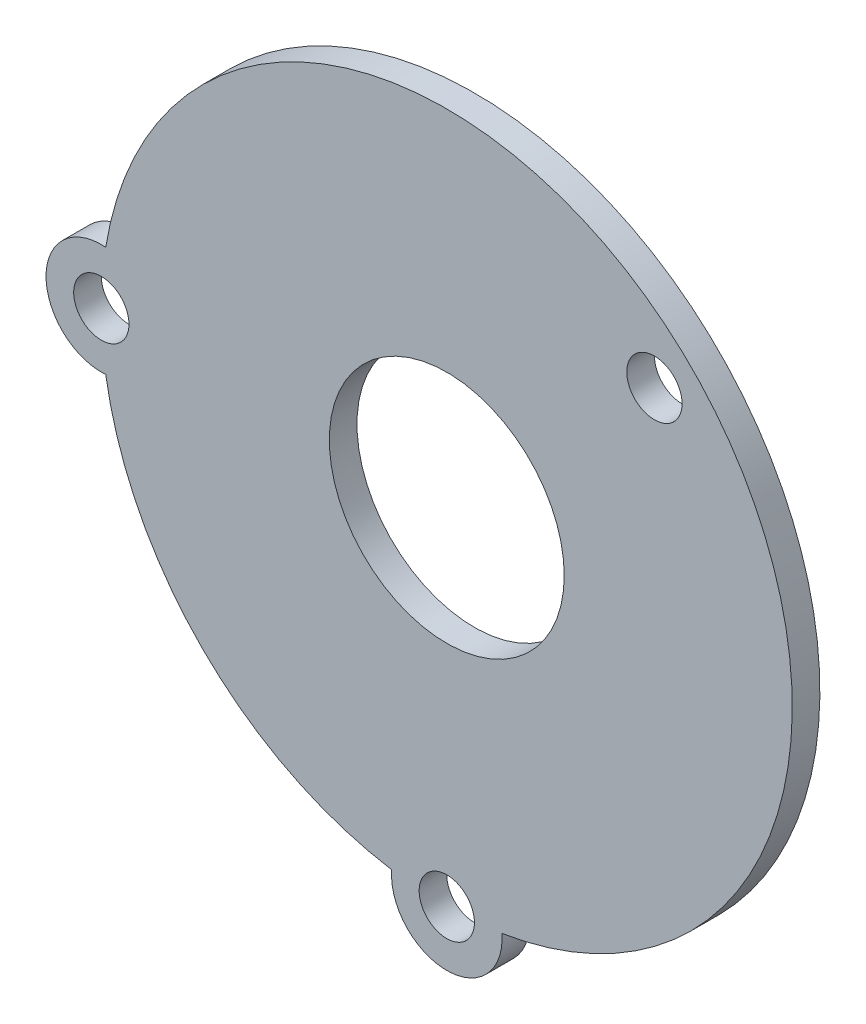
ISO-10303-21;
HEADER;
FILE_DESCRIPTION(('STEP AP214'),'2;1');
FILE_NAME('part.step','',(''),(''),'','','');
FILE_SCHEMA(('AUTOMOTIVE_DESIGN { 1 0 10303 214 1 1 1 1 }'));
ENDSEC;
DATA;
#1=APPLICATION_CONTEXT('core data for automotive mechanical design processes');
#2=APPLICATION_PROTOCOL_DEFINITION('international standard','automotive_design',2000,#1);
#3=PRODUCT_CONTEXT('',#1,'mechanical');
#4=PRODUCT('Part','Part','',(#3));
#5=PRODUCT_RELATED_PRODUCT_CATEGORY('part','',(#4));
#6=PRODUCT_DEFINITION_FORMATION('','',#4);
#7=PRODUCT_DEFINITION_CONTEXT('part definition',#1,'design');
#8=PRODUCT_DEFINITION('design','',#6,#7);
#9=PRODUCT_DEFINITION_SHAPE('','',#8);
#10=(LENGTH_UNIT() NAMED_UNIT(*) SI_UNIT(.MILLI.,.METRE.));
#11=(NAMED_UNIT(*) PLANE_ANGLE_UNIT() SI_UNIT($,.RADIAN.));
#12=(NAMED_UNIT(*) SI_UNIT($,.STERADIAN.) SOLID_ANGLE_UNIT());
#13=UNCERTAINTY_MEASURE_WITH_UNIT(LENGTH_MEASURE(1.E-05),#10,'distance_accuracy_value','');
#14=(GEOMETRIC_REPRESENTATION_CONTEXT(3) GLOBAL_UNCERTAINTY_ASSIGNED_CONTEXT((#13)) GLOBAL_UNIT_ASSIGNED_CONTEXT((#10,
#11,#12)) REPRESENTATION_CONTEXT('',''));
#15=CARTESIAN_POINT('',(0.,0.,0.));
#16=DIRECTION('',(0.,0.,1.));
#17=DIRECTION('',(1.,0.,0.));
#18=AXIS2_PLACEMENT_3D('',#15,#16,#17);
#19=CARTESIAN_POINT('',(-25.,-1.74574066942157E-13,2.));
#20=DIRECTION('',(0.,0.,-1.));
#21=DIRECTION('',(-1.,0.,0.));
#22=AXIS2_PLACEMENT_3D('',#19,#20,#21);
#23=CYLINDRICAL_SURFACE('',#22,4.00000000000001);
#24=CARTESIAN_POINT('',(-25.,-1.74574066942157E-13,0.));
#25=DIRECTION('',(0.,0.,1.));
#26=DIRECTION('',(1.,0.,0.));
#27=AXIS2_PLACEMENT_3D('',#24,#25,#26);
#28=CIRCLE('',#27,4.00000000000001);
#29=CARTESIAN_POINT('',(-24.68,3.98717945420051,0.));
#30=VERTEX_POINT('',#29);
#31=CARTESIAN_POINT('',(-24.68,-3.98717945420086,0.));
#32=VERTEX_POINT('',#31);
#33=EDGE_CURVE('E115',#30,#32,#28,.T.);
#34=ORIENTED_EDGE('',*,*,#33,.T.);
#35=DIRECTION('',(0.,0.,-1.));
#36=VECTOR('',#35,1.);
#37=CARTESIAN_POINT('',(-24.68,-3.98717945420086,2.));
#38=LINE('',#37,#36);
#39=CARTESIAN_POINT('',(-24.68,-3.98717945420086,2.));
#40=VERTEX_POINT('',#39);
#41=EDGE_CURVE('E11',#40,#32,#38,.T.);
#42=ORIENTED_EDGE('',*,*,#41,.F.);
#43=CARTESIAN_POINT('',(-25.,-1.74574066942157E-13,2.));
#44=DIRECTION('',(0.,0.,1.));
#45=DIRECTION('',(1.,0.,0.));
#46=AXIS2_PLACEMENT_3D('',#43,#44,#45);
#47=CIRCLE('',#46,4.00000000000001);
#48=CARTESIAN_POINT('',(-24.68,3.98717945420051,2.));
#49=VERTEX_POINT('',#48);
#50=EDGE_CURVE('E91',#49,#40,#47,.T.);
#51=ORIENTED_EDGE('',*,*,#50,.F.);
#52=DIRECTION('',(0.,0.,-1.));
#53=VECTOR('',#52,1.);
#54=CARTESIAN_POINT('',(-24.68,3.98717945420051,2.));
#55=LINE('',#54,#53);
#56=EDGE_CURVE('E99',#49,#30,#55,.T.);
#57=ORIENTED_EDGE('',*,*,#56,.T.);
#58=EDGE_LOOP('',(#34,#42,#51,#57));
#59=FACE_BOUND('',#58,.T.);
#60=ADVANCED_FACE('F39',(#59),#23,.T.);
#61=CARTESIAN_POINT('',(0.,0.,2.));
#62=DIRECTION('',(0.,0.,-1.));
#63=DIRECTION('',(-1.,0.,0.));
#64=AXIS2_PLACEMENT_3D('',#61,#62,#63);
#65=CYLINDRICAL_SURFACE('',#64,25.);
#66=CARTESIAN_POINT('',(0.,0.,0.));
#67=DIRECTION('',(0.,0.,1.));
#68=DIRECTION('',(1.,0.,0.));
#69=AXIS2_PLACEMENT_3D('',#66,#67,#68);
#70=CIRCLE('',#69,25.);
#71=CARTESIAN_POINT('',(-3.98717945420068,-24.68,0.));
#72=VERTEX_POINT('',#71);
#73=EDGE_CURVE('E95',#32,#72,#70,.T.);
#74=ORIENTED_EDGE('',*,*,#73,.T.);
#75=DIRECTION('',(0.,0.,-1.));
#76=VECTOR('',#75,1.);
#77=CARTESIAN_POINT('',(-3.98717945420068,-24.68,2.));
#78=LINE('',#77,#76);
#79=CARTESIAN_POINT('',(-3.98717945420068,-24.68,2.));
#80=VERTEX_POINT('',#79);
#81=EDGE_CURVE('E48',#80,#72,#78,.T.);
#82=ORIENTED_EDGE('',*,*,#81,.F.);
#83=CARTESIAN_POINT('',(0.,0.,2.));
#84=DIRECTION('',(0.,0.,1.));
#85=DIRECTION('',(1.,0.,0.));
#86=AXIS2_PLACEMENT_3D('',#83,#84,#85);
#87=CIRCLE('',#86,25.);
#88=EDGE_CURVE('E86',#40,#80,#87,.T.);
#89=ORIENTED_EDGE('',*,*,#88,.F.);
#90=ORIENTED_EDGE('',*,*,#41,.T.);
#91=EDGE_LOOP('',(#74,#82,#89,#90));
#92=FACE_BOUND('',#91,.T.);
#93=ADVANCED_FACE('F94',(#92),#65,.T.);
#94=CARTESIAN_POINT('',(0.,-25.,2.));
#95=DIRECTION('',(0.,0.,-1.));
#96=DIRECTION('',(-1.,0.,0.));
#97=AXIS2_PLACEMENT_3D('',#94,#95,#96);
#98=CYLINDRICAL_SURFACE('',#97,4.);
#99=CARTESIAN_POINT('',(0.,-25.,0.));
#100=DIRECTION('',(0.,0.,1.));
#101=DIRECTION('',(1.,0.,0.));
#102=AXIS2_PLACEMENT_3D('',#99,#100,#101);
#103=CIRCLE('',#102,4.);
#104=CARTESIAN_POINT('',(3.98717945420068,-24.68,0.));
#105=VERTEX_POINT('',#104);
#106=EDGE_CURVE('E73',#72,#105,#103,.T.);
#107=ORIENTED_EDGE('',*,*,#106,.T.);
#108=DIRECTION('',(0.,0.,-1.));
#109=VECTOR('',#108,1.);
#110=CARTESIAN_POINT('',(3.98717945420068,-24.68,2.));
#111=LINE('',#110,#109);
#112=CARTESIAN_POINT('',(3.98717945420068,-24.68,2.));
#113=VERTEX_POINT('',#112);
#114=EDGE_CURVE('E96',#113,#105,#111,.T.);
#115=ORIENTED_EDGE('',*,*,#114,.F.);
#116=CARTESIAN_POINT('',(0.,-25.,2.));
#117=DIRECTION('',(0.,0.,1.));
#118=DIRECTION('',(1.,0.,0.));
#119=AXIS2_PLACEMENT_3D('',#116,#117,#118);
#120=CIRCLE('',#119,4.);
#121=EDGE_CURVE('E89',#80,#113,#120,.T.);
#122=ORIENTED_EDGE('',*,*,#121,.F.);
#123=ORIENTED_EDGE('',*,*,#81,.T.);
#124=EDGE_LOOP('',(#107,#115,#122,#123));
#125=FACE_BOUND('',#124,.T.);
#126=ADVANCED_FACE('F97',(#125),#98,.T.);
#127=CARTESIAN_POINT('',(-25.,-1.74574066942157E-13,2.));
#128=DIRECTION('',(0.,0.,-1.));
#129=DIRECTION('',(-1.,0.,0.));
#130=AXIS2_PLACEMENT_3D('',#127,#128,#129);
#131=CYLINDRICAL_SURFACE('',#130,2.);
#132=CARTESIAN_POINT('',(-25.,-1.74574066942157E-13,2.));
#133=DIRECTION('',(0.,0.,1.));
#134=DIRECTION('',(1.,0.,0.));
#135=AXIS2_PLACEMENT_3D('',#132,#133,#134);
#136=CIRCLE('',#135,2.);
#137=CARTESIAN_POINT('',(-23.,-1.74574066942157E-13,2.));
#138=VERTEX_POINT('',#137);
#139=EDGE_CURVE('E128',#138,#138,#136,.T.);
#140=ORIENTED_EDGE('',*,*,#139,.T.);
#141=EDGE_LOOP('',(#140));
#142=FACE_BOUND('',#141,.T.);
#143=CARTESIAN_POINT('',(-25.,-1.74574066942157E-13,0.));
#144=DIRECTION('',(0.,0.,1.));
#145=DIRECTION('',(1.,0.,0.));
#146=AXIS2_PLACEMENT_3D('',#143,#144,#145);
#147=CIRCLE('',#146,2.);
#148=CARTESIAN_POINT('',(-23.,-1.74574066942157E-13,0.));
#149=VERTEX_POINT('',#148);
#150=EDGE_CURVE('E112',#149,#149,#147,.T.);
#151=ORIENTED_EDGE('',*,*,#150,.F.);
#152=EDGE_LOOP('',(#151));
#153=FACE_BOUND('',#152,.T.);
#154=ADVANCED_FACE('F152',(#142,#153),#131,.F.);
#155=CARTESIAN_POINT('',(15.0260191002141,15.0260191002141,2.));
#156=DIRECTION('',(0.,0.,-1.));
#157=DIRECTION('',(-1.,0.,0.));
#158=AXIS2_PLACEMENT_3D('',#155,#156,#157);
#159=CYLINDRICAL_SURFACE('',#158,2.00000000000001);
#160=CARTESIAN_POINT('',(15.0260191002141,15.0260191002141,2.));
#161=DIRECTION('',(0.,0.,1.));
#162=DIRECTION('',(1.,0.,0.));
#163=AXIS2_PLACEMENT_3D('',#160,#161,#162);
#164=CIRCLE('',#163,2.00000000000001);
#165=CARTESIAN_POINT('',(17.0260191002141,15.0260191002141,2.));
#166=VERTEX_POINT('',#165);
#167=EDGE_CURVE('E130',#166,#166,#164,.T.);
#168=ORIENTED_EDGE('',*,*,#167,.T.);
#169=EDGE_LOOP('',(#168));
#170=FACE_BOUND('',#169,.T.);
#171=CARTESIAN_POINT('',(15.0260191002141,15.0260191002141,0.));
#172=DIRECTION('',(0.,0.,1.));
#173=DIRECTION('',(1.,0.,0.));
#174=AXIS2_PLACEMENT_3D('',#171,#172,#173);
#175=CIRCLE('',#174,2.00000000000001);
#176=CARTESIAN_POINT('',(17.0260191002141,15.0260191002141,0.));
#177=VERTEX_POINT('',#176);
#178=EDGE_CURVE('E109',#177,#177,#175,.T.);
#179=ORIENTED_EDGE('',*,*,#178,.F.);
#180=EDGE_LOOP('',(#179));
#181=FACE_BOUND('',#180,.T.);
#182=ADVANCED_FACE('F155',(#170,#181),#159,.F.);
#183=CARTESIAN_POINT('',(0.,-25.,2.));
#184=DIRECTION('',(0.,0.,-1.));
#185=DIRECTION('',(-1.,0.,0.));
#186=AXIS2_PLACEMENT_3D('',#183,#184,#185);
#187=CYLINDRICAL_SURFACE('',#186,2.);
#188=CARTESIAN_POINT('',(0.,-25.,2.));
#189=DIRECTION('',(0.,0.,1.));
#190=DIRECTION('',(1.,0.,0.));
#191=AXIS2_PLACEMENT_3D('',#188,#189,#190);
#192=CIRCLE('',#191,2.);
#193=CARTESIAN_POINT('',(2.,-25.,2.));
#194=VERTEX_POINT('',#193);
#195=EDGE_CURVE('E135',#194,#194,#192,.T.);
#196=ORIENTED_EDGE('',*,*,#195,.T.);
#197=EDGE_LOOP('',(#196));
#198=FACE_BOUND('',#197,.T.);
#199=CARTESIAN_POINT('',(0.,-25.,0.));
#200=DIRECTION('',(0.,0.,1.));
#201=DIRECTION('',(1.,0.,0.));
#202=AXIS2_PLACEMENT_3D('',#199,#200,#201);
#203=CIRCLE('',#202,2.);
#204=CARTESIAN_POINT('',(2.,-25.,0.));
#205=VERTEX_POINT('',#204);
#206=EDGE_CURVE('E106',#205,#205,#203,.T.);
#207=ORIENTED_EDGE('',*,*,#206,.F.);
#208=EDGE_LOOP('',(#207));
#209=FACE_BOUND('',#208,.T.);
#210=ADVANCED_FACE('F175',(#198,#209),#187,.F.);
#211=CARTESIAN_POINT('',(0.,0.,2.));
#212=DIRECTION('',(0.,0.,-1.));
#213=DIRECTION('',(-1.,0.,0.));
#214=AXIS2_PLACEMENT_3D('',#211,#212,#213);
#215=CYLINDRICAL_SURFACE('',#214,8.5);
#216=CARTESIAN_POINT('',(0.,0.,2.));
#217=DIRECTION('',(0.,0.,1.));
#218=DIRECTION('',(1.,0.,0.));
#219=AXIS2_PLACEMENT_3D('',#216,#217,#218);
#220=CIRCLE('',#219,8.5);
#221=CARTESIAN_POINT('',(8.5,0.,2.));
#222=VERTEX_POINT('',#221);
#223=EDGE_CURVE('E121',#222,#222,#220,.T.);
#224=ORIENTED_EDGE('',*,*,#223,.T.);
#225=EDGE_LOOP('',(#224));
#226=FACE_BOUND('',#225,.T.);
#227=CARTESIAN_POINT('',(0.,0.,0.));
#228=DIRECTION('',(0.,0.,1.));
#229=DIRECTION('',(1.,0.,0.));
#230=AXIS2_PLACEMENT_3D('',#227,#228,#229);
#231=CIRCLE('',#230,8.5);
#232=CARTESIAN_POINT('',(8.5,0.,0.));
#233=VERTEX_POINT('',#232);
#234=EDGE_CURVE('E103',#233,#233,#231,.T.);
#235=ORIENTED_EDGE('',*,*,#234,.F.);
#236=EDGE_LOOP('',(#235));
#237=FACE_BOUND('',#236,.T.);
#238=ADVANCED_FACE('F41',(#226,#237),#215,.F.);
#239=CARTESIAN_POINT('',(0.,0.,2.));
#240=DIRECTION('',(0.,0.,-1.));
#241=DIRECTION('',(-1.,0.,0.));
#242=AXIS2_PLACEMENT_3D('',#239,#240,#241);
#243=CYLINDRICAL_SURFACE('',#242,25.);
#244=CARTESIAN_POINT('',(0.,0.,0.));
#245=DIRECTION('',(0.,0.,1.));
#246=DIRECTION('',(1.,0.,0.));
#247=AXIS2_PLACEMENT_3D('',#244,#245,#246);
#248=CIRCLE('',#247,25.);
#249=EDGE_CURVE('E79',#105,#30,#248,.T.);
#250=ORIENTED_EDGE('',*,*,#249,.T.);
#251=ORIENTED_EDGE('',*,*,#56,.F.);
#252=CARTESIAN_POINT('',(0.,0.,2.));
#253=DIRECTION('',(0.,0.,1.));
#254=DIRECTION('',(1.,0.,0.));
#255=AXIS2_PLACEMENT_3D('',#252,#253,#254);
#256=CIRCLE('',#255,25.);
#257=EDGE_CURVE('E56',#113,#49,#256,.T.);
#258=ORIENTED_EDGE('',*,*,#257,.F.);
#259=ORIENTED_EDGE('',*,*,#114,.T.);
#260=EDGE_LOOP('',(#250,#251,#258,#259));
#261=FACE_BOUND('',#260,.T.);
#262=ADVANCED_FACE('F123',(#261),#243,.T.);
#263=CARTESIAN_POINT('',(0.,0.,2.));
#264=DIRECTION('',(0.,0.,1.));
#265=DIRECTION('',(1.,0.,0.));
#266=AXIS2_PLACEMENT_3D('',#263,#264,#265);
#267=PLANE('',#266);
#268=ORIENTED_EDGE('',*,*,#223,.F.);
#269=EDGE_LOOP('',(#268));
#270=FACE_BOUND('',#269,.T.);
#271=ORIENTED_EDGE('',*,*,#195,.F.);
#272=EDGE_LOOP('',(#271));
#273=FACE_BOUND('',#272,.T.);
#274=ORIENTED_EDGE('',*,*,#167,.F.);
#275=EDGE_LOOP('',(#274));
#276=FACE_BOUND('',#275,.T.);
#277=ORIENTED_EDGE('',*,*,#139,.F.);
#278=EDGE_LOOP('',(#277));
#279=FACE_BOUND('',#278,.T.);
#280=ORIENTED_EDGE('',*,*,#50,.T.);
#281=ORIENTED_EDGE('',*,*,#88,.T.);
#282=ORIENTED_EDGE('',*,*,#121,.T.);
#283=ORIENTED_EDGE('',*,*,#257,.T.);
#284=EDGE_LOOP('',(#280,#281,#282,#283));
#285=FACE_BOUND('',#284,.T.);
#286=ADVANCED_FACE('F87',(#270,#273,#276,#279,#285),#267,.T.);
#287=CARTESIAN_POINT('',(0.,0.,0.));
#288=DIRECTION('',(0.,0.,1.));
#289=DIRECTION('',(1.,0.,0.));
#290=AXIS2_PLACEMENT_3D('',#287,#288,#289);
#291=PLANE('',#290);
#292=ORIENTED_EDGE('',*,*,#234,.T.);
#293=EDGE_LOOP('',(#292));
#294=FACE_BOUND('',#293,.T.);
#295=ORIENTED_EDGE('',*,*,#206,.T.);
#296=EDGE_LOOP('',(#295));
#297=FACE_BOUND('',#296,.T.);
#298=ORIENTED_EDGE('',*,*,#178,.T.);
#299=EDGE_LOOP('',(#298));
#300=FACE_BOUND('',#299,.T.);
#301=ORIENTED_EDGE('',*,*,#150,.T.);
#302=EDGE_LOOP('',(#301));
#303=FACE_BOUND('',#302,.T.);
#304=ORIENTED_EDGE('',*,*,#33,.F.);
#305=ORIENTED_EDGE('',*,*,#249,.F.);
#306=ORIENTED_EDGE('',*,*,#106,.F.);
#307=ORIENTED_EDGE('',*,*,#73,.F.);
#308=EDGE_LOOP('',(#304,#305,#306,#307));
#309=FACE_BOUND('',#308,.T.);
#310=ADVANCED_FACE('F126',(#294,#297,#300,#303,#309),#291,.F.);
#311=CLOSED_SHELL('',(#60,#93,#126,#154,#182,#210,#238,#262,#286,#310));
#312=MANIFOLD_SOLID_BREP('B2',#311);
#313=ADVANCED_BREP_SHAPE_REPRESENTATION('',(#18,#312),#14);
#314=SHAPE_DEFINITION_REPRESENTATION(#9,#313);
ENDSEC;
END-ISO-10303-21;
